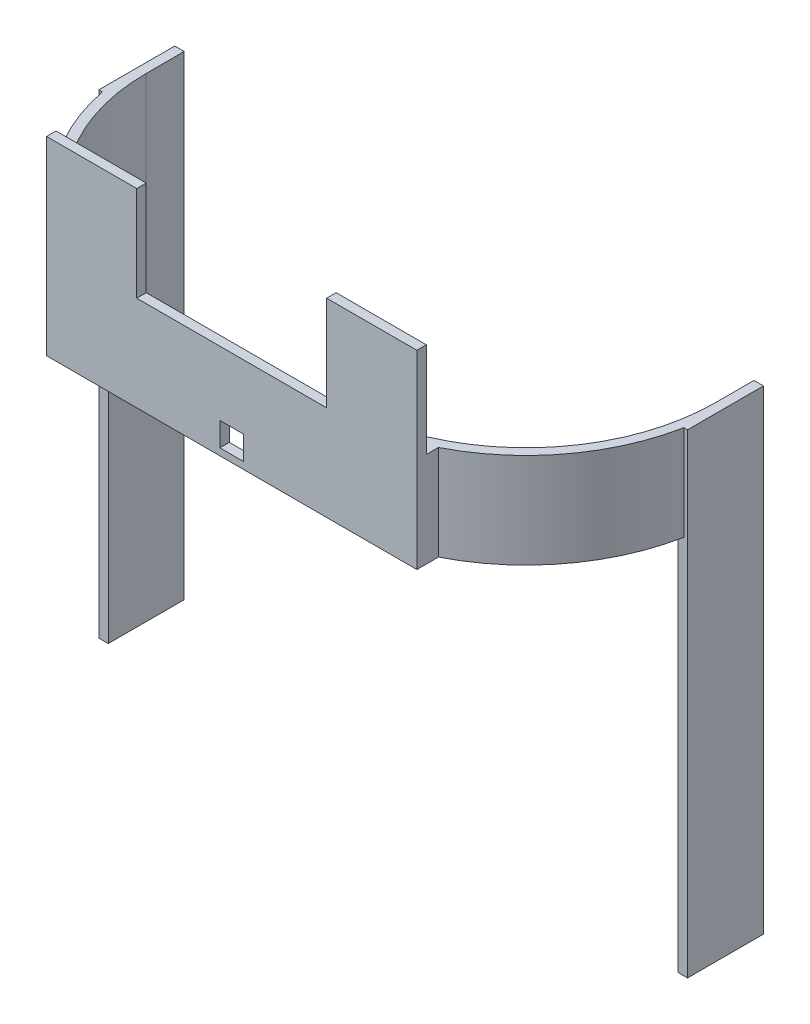
ISO-10303-21;
HEADER;
FILE_DESCRIPTION(('STEP AP214'),'2;1');
FILE_NAME('part.step','',(''),(''),'','','');
FILE_SCHEMA(('AUTOMOTIVE_DESIGN { 1 0 10303 214 1 1 1 1 }'));
ENDSEC;
DATA;
#1=APPLICATION_CONTEXT('core data for automotive mechanical design processes');
#2=APPLICATION_PROTOCOL_DEFINITION('international standard','automotive_design',2000,#1);
#3=PRODUCT_CONTEXT('',#1,'mechanical');
#4=PRODUCT('Part','Part','',(#3));
#5=PRODUCT_RELATED_PRODUCT_CATEGORY('part','',(#4));
#6=PRODUCT_DEFINITION_FORMATION('','',#4);
#7=PRODUCT_DEFINITION_CONTEXT('part definition',#1,'design');
#8=PRODUCT_DEFINITION('design','',#6,#7);
#9=PRODUCT_DEFINITION_SHAPE('','',#8);
#10=(LENGTH_UNIT() NAMED_UNIT(*) SI_UNIT(.MILLI.,.METRE.));
#11=(NAMED_UNIT(*) PLANE_ANGLE_UNIT() SI_UNIT($,.RADIAN.));
#12=(NAMED_UNIT(*) SI_UNIT($,.STERADIAN.) SOLID_ANGLE_UNIT());
#13=UNCERTAINTY_MEASURE_WITH_UNIT(LENGTH_MEASURE(1.E-05),#10,'distance_accuracy_value','');
#14=(GEOMETRIC_REPRESENTATION_CONTEXT(3) GLOBAL_UNCERTAINTY_ASSIGNED_CONTEXT((#13)) GLOBAL_UNIT_ASSIGNED_CONTEXT((#10,
#11,#12)) REPRESENTATION_CONTEXT('',''));
#15=CARTESIAN_POINT('',(0.,0.,0.));
#16=DIRECTION('',(0.,0.,1.));
#17=DIRECTION('',(1.,0.,0.));
#18=AXIS2_PLACEMENT_3D('',#15,#16,#17);
#19=CARTESIAN_POINT('',(40.,40.,0.));
#20=DIRECTION('',(0.,1.,0.));
#21=DIRECTION('',(0.,0.,1.));
#22=AXIS2_PLACEMENT_3D('',#19,#20,#21);
#23=PLANE('',#22);
#24=CARTESIAN_POINT('',(40.,40.,0.));
#25=DIRECTION('',(0.,-1.,0.));
#26=DIRECTION('',(0.,0.,1.));
#27=AXIS2_PLACEMENT_3D('',#24,#25,#26);
#28=CIRCLE('',#27,80.);
#29=CARTESIAN_POINT('',(120.,40.,0.));
#30=VERTEX_POINT('',#29);
#31=CARTESIAN_POINT('',(40.,40.,80.));
#32=VERTEX_POINT('',#31);
#33=EDGE_CURVE('E263',#30,#32,#28,.T.);
#34=ORIENTED_EDGE('',*,*,#33,.T.);
#35=DIRECTION('',(-1.,0.,0.));
#36=VECTOR('',#35,1.);
#37=CARTESIAN_POINT('',(78.,40.,80.));
#38=LINE('',#37,#36);
#39=CARTESIAN_POINT('',(78.,40.,80.));
#40=VERTEX_POINT('',#39);
#41=EDGE_CURVE('E400',#40,#32,#38,.T.);
#42=ORIENTED_EDGE('',*,*,#41,.F.);
#43=DIRECTION('',(0.,0.,-1.));
#44=VECTOR('',#43,1.);
#45=CARTESIAN_POINT('',(78.,40.,84.));
#46=LINE('',#45,#44);
#47=CARTESIAN_POINT('',(78.,40.,74.9132832013121));
#48=VERTEX_POINT('',#47);
#49=EDGE_CURVE('E357',#40,#48,#46,.T.);
#50=ORIENTED_EDGE('',*,*,#49,.T.);
#51=CARTESIAN_POINT('',(40.,40.,0.));
#52=DIRECTION('',(0.,1.,0.));
#53=DIRECTION('',(0.,0.,1.));
#54=AXIS2_PLACEMENT_3D('',#51,#52,#53);
#55=CIRCLE('',#54,84.);
#56=CARTESIAN_POINT('',(122.462112512353,40.,16.));
#57=VERTEX_POINT('',#56);
#58=EDGE_CURVE('E285',#48,#57,#55,.T.);
#59=ORIENTED_EDGE('',*,*,#58,.T.);
#60=DIRECTION('',(1.,0.,0.));
#61=VECTOR('',#60,1.);
#62=CARTESIAN_POINT('',(122.462112512353,40.,16.));
#63=LINE('',#62,#61);
#64=CARTESIAN_POINT('',(124.,40.,16.));
#65=VERTEX_POINT('',#64);
#66=EDGE_CURVE('E283',#57,#65,#63,.T.);
#67=ORIENTED_EDGE('',*,*,#66,.T.);
#68=DIRECTION('',(0.,0.,-1.));
#69=VECTOR('',#68,1.);
#70=CARTESIAN_POINT('',(124.,40.,-16.));
#71=LINE('',#70,#69);
#72=CARTESIAN_POINT('',(124.,40.,-16.));
#73=VERTEX_POINT('',#72);
#74=EDGE_CURVE('E281',#65,#73,#71,.T.);
#75=ORIENTED_EDGE('',*,*,#74,.T.);
#76=DIRECTION('',(-1.,0.,0.));
#77=VECTOR('',#76,1.);
#78=CARTESIAN_POINT('',(120.,40.,-16.));
#79=LINE('',#78,#77);
#80=CARTESIAN_POINT('',(120.,40.,-16.));
#81=VERTEX_POINT('',#80);
#82=EDGE_CURVE('E279',#73,#81,#79,.T.);
#83=ORIENTED_EDGE('',*,*,#82,.T.);
#84=DIRECTION('',(0.,0.,1.));
#85=VECTOR('',#84,1.);
#86=CARTESIAN_POINT('',(120.,40.,-16.));
#87=LINE('',#86,#85);
#88=EDGE_CURVE('E260',#81,#30,#87,.T.);
#89=ORIENTED_EDGE('',*,*,#88,.T.);
#90=EDGE_LOOP('',(#34,#42,#50,#59,#67,#75,#83,#89));
#91=FACE_BOUND('',#90,.T.);
#92=ADVANCED_FACE('F34',(#91),#23,.T.);
#93=DIRECTION('',(1.,0.,0.));
#94=VECTOR('',#93,1.);
#95=CARTESIAN_POINT('',(-40.,40.,84.));
#96=LINE('',#95,#94);
#97=CARTESIAN_POINT('',(-40.,40.,84.));
#98=VERTEX_POINT('',#97);
#99=CARTESIAN_POINT('',(40.,40.,84.));
#100=VERTEX_POINT('',#99);
#101=EDGE_CURVE('E287',#98,#100,#96,.T.);
#102=ORIENTED_EDGE('',*,*,#101,.T.);
#103=DIRECTION('',(0.,0.,1.));
#104=VECTOR('',#103,1.);
#105=CARTESIAN_POINT('',(40.,40.,84.));
#106=LINE('',#105,#104);
#107=EDGE_CURVE('E396',#32,#100,#106,.T.);
#108=ORIENTED_EDGE('',*,*,#107,.F.);
#109=DIRECTION('',(-1.,0.,0.));
#110=VECTOR('',#109,1.);
#111=CARTESIAN_POINT('',(-40.,40.,80.));
#112=LINE('',#111,#110);
#113=CARTESIAN_POINT('',(-40.,40.,80.));
#114=VERTEX_POINT('',#113);
#115=EDGE_CURVE('E302',#32,#114,#112,.T.);
#116=ORIENTED_EDGE('',*,*,#115,.T.);
#117=DIRECTION('',(0.,0.,-1.));
#118=VECTOR('',#117,1.);
#119=CARTESIAN_POINT('',(-40.,40.,84.));
#120=LINE('',#119,#118);
#121=EDGE_CURVE('E376',#98,#114,#120,.T.);
#122=ORIENTED_EDGE('',*,*,#121,.F.);
#123=EDGE_LOOP('',(#102,#108,#116,#122));
#124=FACE_BOUND('',#123,.T.);
#125=ADVANCED_FACE('F489',(#124),#23,.T.);
#126=DIRECTION('',(-1.,0.,0.));
#127=VECTOR('',#126,1.);
#128=CARTESIAN_POINT('',(-78.,40.,80.));
#129=LINE('',#128,#127);
#130=CARTESIAN_POINT('',(-78.,40.,80.));
#131=VERTEX_POINT('',#130);
#132=EDGE_CURVE('E372',#114,#131,#129,.T.);
#133=ORIENTED_EDGE('',*,*,#132,.F.);
#134=CARTESIAN_POINT('',(-40.,40.,0.));
#135=DIRECTION('',(0.,-1.,0.));
#136=DIRECTION('',(0.,0.,1.));
#137=AXIS2_PLACEMENT_3D('',#134,#135,#136);
#138=CIRCLE('',#137,80.);
#139=CARTESIAN_POINT('',(-120.,40.,0.));
#140=VERTEX_POINT('',#139);
#141=EDGE_CURVE('E300',#114,#140,#138,.T.);
#142=ORIENTED_EDGE('',*,*,#141,.T.);
#143=DIRECTION('',(0.,0.,-1.));
#144=VECTOR('',#143,1.);
#145=CARTESIAN_POINT('',(-120.,40.,-16.));
#146=LINE('',#145,#144);
#147=CARTESIAN_POINT('',(-120.,40.,-16.));
#148=VERTEX_POINT('',#147);
#149=EDGE_CURVE('E298',#140,#148,#146,.T.);
#150=ORIENTED_EDGE('',*,*,#149,.T.);
#151=DIRECTION('',(-1.,0.,0.));
#152=VECTOR('',#151,1.);
#153=CARTESIAN_POINT('',(-124.,40.,-16.));
#154=LINE('',#153,#152);
#155=CARTESIAN_POINT('',(-124.,40.,-16.));
#156=VERTEX_POINT('',#155);
#157=EDGE_CURVE('E296',#148,#156,#154,.T.);
#158=ORIENTED_EDGE('',*,*,#157,.T.);
#159=DIRECTION('',(0.,0.,1.));
#160=VECTOR('',#159,1.);
#161=CARTESIAN_POINT('',(-124.,40.,-16.));
#162=LINE('',#161,#160);
#163=CARTESIAN_POINT('',(-124.,40.,16.));
#164=VERTEX_POINT('',#163);
#165=EDGE_CURVE('E294',#156,#164,#162,.T.);
#166=ORIENTED_EDGE('',*,*,#165,.T.);
#167=DIRECTION('',(1.,0.,0.));
#168=VECTOR('',#167,1.);
#169=CARTESIAN_POINT('',(-124.,40.,16.));
#170=LINE('',#169,#168);
#171=CARTESIAN_POINT('',(-122.462112512353,40.,16.));
#172=VERTEX_POINT('',#171);
#173=EDGE_CURVE('E292',#164,#172,#170,.T.);
#174=ORIENTED_EDGE('',*,*,#173,.T.);
#175=CARTESIAN_POINT('',(-40.,40.,0.));
#176=DIRECTION('',(0.,1.,0.));
#177=DIRECTION('',(0.,0.,1.));
#178=AXIS2_PLACEMENT_3D('',#175,#176,#177);
#179=CIRCLE('',#178,84.);
#180=CARTESIAN_POINT('',(-78.,40.,74.9132832013121));
#181=VERTEX_POINT('',#180);
#182=EDGE_CURVE('E289',#172,#181,#179,.T.);
#183=ORIENTED_EDGE('',*,*,#182,.T.);
#184=DIRECTION('',(0.,0.,1.));
#185=VECTOR('',#184,1.);
#186=CARTESIAN_POINT('',(-78.,40.,84.));
#187=LINE('',#186,#185);
#188=EDGE_CURVE('E354',#181,#131,#187,.T.);
#189=ORIENTED_EDGE('',*,*,#188,.T.);
#190=EDGE_LOOP('',(#133,#142,#150,#158,#166,#174,#183,#189));
#191=FACE_BOUND('',#190,.T.);
#192=ADVANCED_FACE('F470',(#191),#23,.T.);
#193=CARTESIAN_POINT('',(40.,0.,0.));
#194=DIRECTION('',(0.,1.,0.));
#195=DIRECTION('',(0.,0.,1.));
#196=AXIS2_PLACEMENT_3D('',#193,#194,#195);
#197=PLANE('',#196);
#198=DIRECTION('',(0.,0.,1.));
#199=VECTOR('',#198,1.);
#200=CARTESIAN_POINT('',(-78.,0.,84.));
#201=LINE('',#200,#199);
#202=CARTESIAN_POINT('',(-78.,0.,74.9132832013121));
#203=VERTEX_POINT('',#202);
#204=CARTESIAN_POINT('',(-78.,0.,84.));
#205=VERTEX_POINT('',#204);
#206=EDGE_CURVE('E350',#203,#205,#201,.T.);
#207=ORIENTED_EDGE('',*,*,#206,.F.);
#208=CARTESIAN_POINT('',(-40.,0.,0.));
#209=DIRECTION('',(0.,1.,0.));
#210=DIRECTION('',(0.,0.,1.));
#211=AXIS2_PLACEMENT_3D('',#208,#209,#210);
#212=CIRCLE('',#211,84.);
#213=CARTESIAN_POINT('',(-122.462112512353,0.,16.));
#214=VERTEX_POINT('',#213);
#215=EDGE_CURVE('E266',#214,#203,#212,.T.);
#216=ORIENTED_EDGE('',*,*,#215,.F.);
#217=DIRECTION('',(-1.,0.,0.));
#218=VECTOR('',#217,1.);
#219=CARTESIAN_POINT('',(-124.,0.,16.));
#220=LINE('',#219,#218);
#221=CARTESIAN_POINT('',(-120.,0.,16.));
#222=VERTEX_POINT('',#221);
#223=EDGE_CURVE('E310',#222,#214,#220,.T.);
#224=ORIENTED_EDGE('',*,*,#223,.F.);
#225=DIRECTION('',(0.,0.,1.));
#226=VECTOR('',#225,1.);
#227=CARTESIAN_POINT('',(-120.,0.,-16.));
#228=LINE('',#227,#226);
#229=CARTESIAN_POINT('',(-120.,0.,0.));
#230=VERTEX_POINT('',#229);
#231=EDGE_CURVE('E215',#230,#222,#228,.T.);
#232=ORIENTED_EDGE('',*,*,#231,.F.);
#233=CARTESIAN_POINT('',(-40.,0.,0.));
#234=DIRECTION('',(0.,-1.,0.));
#235=DIRECTION('',(0.,0.,1.));
#236=AXIS2_PLACEMENT_3D('',#233,#234,#235);
#237=CIRCLE('',#236,80.);
#238=CARTESIAN_POINT('',(-40.,0.,80.));
#239=VERTEX_POINT('',#238);
#240=EDGE_CURVE('E269',#239,#230,#237,.T.);
#241=ORIENTED_EDGE('',*,*,#240,.F.);
#242=DIRECTION('',(-1.,0.,0.));
#243=VECTOR('',#242,1.);
#244=CARTESIAN_POINT('',(-40.,0.,80.));
#245=LINE('',#244,#243);
#246=CARTESIAN_POINT('',(40.,0.,80.));
#247=VERTEX_POINT('',#246);
#248=EDGE_CURVE('E272',#247,#239,#245,.T.);
#249=ORIENTED_EDGE('',*,*,#248,.F.);
#250=CARTESIAN_POINT('',(40.,0.,0.));
#251=DIRECTION('',(0.,-1.,0.));
#252=DIRECTION('',(0.,0.,1.));
#253=AXIS2_PLACEMENT_3D('',#250,#251,#252);
#254=CIRCLE('',#253,80.);
#255=CARTESIAN_POINT('',(120.,0.,0.));
#256=VERTEX_POINT('',#255);
#257=EDGE_CURVE('E274',#256,#247,#254,.T.);
#258=ORIENTED_EDGE('',*,*,#257,.F.);
#259=DIRECTION('',(0.,0.,-1.));
#260=VECTOR('',#259,1.);
#261=CARTESIAN_POINT('',(120.,0.,-16.));
#262=LINE('',#261,#260);
#263=CARTESIAN_POINT('',(120.,0.,16.));
#264=VERTEX_POINT('',#263);
#265=EDGE_CURVE('E332',#264,#256,#262,.T.);
#266=ORIENTED_EDGE('',*,*,#265,.F.);
#267=DIRECTION('',(-1.,0.,0.));
#268=VECTOR('',#267,1.);
#269=CARTESIAN_POINT('',(120.,0.,16.));
#270=LINE('',#269,#268);
#271=CARTESIAN_POINT('',(122.462112512353,0.,16.));
#272=VERTEX_POINT('',#271);
#273=EDGE_CURVE('E329',#272,#264,#270,.T.);
#274=ORIENTED_EDGE('',*,*,#273,.F.);
#275=CARTESIAN_POINT('',(40.,0.,0.));
#276=DIRECTION('',(0.,1.,0.));
#277=DIRECTION('',(0.,0.,1.));
#278=AXIS2_PLACEMENT_3D('',#275,#276,#277);
#279=CIRCLE('',#278,84.);
#280=CARTESIAN_POINT('',(78.,0.,74.9132832013121));
#281=VERTEX_POINT('',#280);
#282=EDGE_CURVE('E261',#281,#272,#279,.T.);
#283=ORIENTED_EDGE('',*,*,#282,.F.);
#284=DIRECTION('',(0.,0.,-1.));
#285=VECTOR('',#284,1.);
#286=CARTESIAN_POINT('',(78.,0.,84.));
#287=LINE('',#286,#285);
#288=CARTESIAN_POINT('',(78.,0.,84.));
#289=VERTEX_POINT('',#288);
#290=EDGE_CURVE('E356',#289,#281,#287,.T.);
#291=ORIENTED_EDGE('',*,*,#290,.F.);
#292=DIRECTION('',(1.,0.,0.));
#293=VECTOR('',#292,1.);
#294=CARTESIAN_POINT('',(-40.,0.,84.));
#295=LINE('',#294,#293);
#296=EDGE_CURVE('E264',#205,#289,#295,.T.);
#297=ORIENTED_EDGE('',*,*,#296,.F.);
#298=EDGE_LOOP('',(#207,#216,#224,#232,#241,#249,#258,#266,#274,#283,#291,#297));
#299=FACE_BOUND('',#298,.T.);
#300=ADVANCED_FACE('F443',(#299),#197,.F.);
#301=CARTESIAN_POINT('',(40.,40.,0.));
#302=DIRECTION('',(0.,-1.,0.));
#303=DIRECTION('',(0.,0.,-1.));
#304=AXIS2_PLACEMENT_3D('',#301,#302,#303);
#305=CYLINDRICAL_SURFACE('',#304,80.);
#306=ORIENTED_EDGE('',*,*,#257,.T.);
#307=DIRECTION('',(0.,-1.,0.));
#308=VECTOR('',#307,1.);
#309=CARTESIAN_POINT('',(40.,40.,80.));
#310=LINE('',#309,#308);
#311=EDGE_CURVE('E231',#32,#247,#310,.T.);
#312=ORIENTED_EDGE('',*,*,#311,.F.);
#313=ORIENTED_EDGE('',*,*,#33,.F.);
#314=DIRECTION('',(0.,-1.,0.));
#315=VECTOR('',#314,1.);
#316=CARTESIAN_POINT('',(120.,40.,0.));
#317=LINE('',#316,#315);
#318=EDGE_CURVE('E257',#30,#256,#317,.T.);
#319=ORIENTED_EDGE('',*,*,#318,.T.);
#320=EDGE_LOOP('',(#306,#312,#313,#319));
#321=FACE_BOUND('',#320,.T.);
#322=ADVANCED_FACE('F36',(#321),#305,.F.);
#323=CARTESIAN_POINT('',(-40.,40.,80.));
#324=DIRECTION('',(0.,0.,1.));
#325=DIRECTION('',(1.,0.,0.));
#326=AXIS2_PLACEMENT_3D('',#323,#324,#325);
#327=PLANE('',#326);
#328=DIRECTION('',(-1.,0.,0.));
#329=VECTOR('',#328,1.);
#330=CARTESIAN_POINT('',(-40.,12.9060091255901,80.));
#331=LINE('',#330,#329);
#332=CARTESIAN_POINT('',(5.00000000000001,12.9060091255901,80.));
#333=VERTEX_POINT('',#332);
#334=CARTESIAN_POINT('',(-4.99999999999998,12.9060091255901,80.));
#335=VERTEX_POINT('',#334);
#336=EDGE_CURVE('E414',#333,#335,#331,.T.);
#337=ORIENTED_EDGE('',*,*,#336,.T.);
#338=DIRECTION('',(0.,-1.,0.));
#339=VECTOR('',#338,1.);
#340=CARTESIAN_POINT('',(-4.99999999999998,40.,80.));
#341=LINE('',#340,#339);
#342=CARTESIAN_POINT('',(-4.99999999999998,2.90600912559006,80.));
#343=VERTEX_POINT('',#342);
#344=EDGE_CURVE('E403',#335,#343,#341,.T.);
#345=ORIENTED_EDGE('',*,*,#344,.T.);
#346=DIRECTION('',(1.,0.,0.));
#347=VECTOR('',#346,1.);
#348=CARTESIAN_POINT('',(-40.,2.90600912559006,80.));
#349=LINE('',#348,#347);
#350=CARTESIAN_POINT('',(5.00000000000001,2.90600912559006,80.));
#351=VERTEX_POINT('',#350);
#352=EDGE_CURVE('E418',#343,#351,#349,.T.);
#353=ORIENTED_EDGE('',*,*,#352,.T.);
#354=DIRECTION('',(0.,1.,0.));
#355=VECTOR('',#354,1.);
#356=CARTESIAN_POINT('',(5.,40.,80.));
#357=LINE('',#356,#355);
#358=EDGE_CURVE('E222',#351,#333,#357,.T.);
#359=ORIENTED_EDGE('',*,*,#358,.T.);
#360=EDGE_LOOP('',(#337,#345,#353,#359));
#361=FACE_BOUND('',#360,.T.);
#362=ORIENTED_EDGE('',*,*,#248,.T.);
#363=DIRECTION('',(0.,-1.,0.));
#364=VECTOR('',#363,1.);
#365=CARTESIAN_POINT('',(-40.,40.,80.));
#366=LINE('',#365,#364);
#367=EDGE_CURVE('E234',#114,#239,#366,.T.);
#368=ORIENTED_EDGE('',*,*,#367,.F.);
#369=ORIENTED_EDGE('',*,*,#115,.F.);
#370=ORIENTED_EDGE('',*,*,#311,.T.);
#371=EDGE_LOOP('',(#362,#368,#369,#370));
#372=FACE_BOUND('',#371,.T.);
#373=ADVANCED_FACE('F430',(#361,#372),#327,.F.);
#374=CARTESIAN_POINT('',(-40.,40.,0.));
#375=DIRECTION('',(0.,-1.,0.));
#376=DIRECTION('',(0.,0.,-1.));
#377=AXIS2_PLACEMENT_3D('',#374,#375,#376);
#378=CYLINDRICAL_SURFACE('',#377,80.);
#379=ORIENTED_EDGE('',*,*,#240,.T.);
#380=DIRECTION('',(0.,-1.,0.));
#381=VECTOR('',#380,1.);
#382=CARTESIAN_POINT('',(-120.,40.,0.));
#383=LINE('',#382,#381);
#384=EDGE_CURVE('E237',#140,#230,#383,.T.);
#385=ORIENTED_EDGE('',*,*,#384,.F.);
#386=ORIENTED_EDGE('',*,*,#141,.F.);
#387=ORIENTED_EDGE('',*,*,#367,.T.);
#388=EDGE_LOOP('',(#379,#385,#386,#387));
#389=FACE_BOUND('',#388,.T.);
#390=ADVANCED_FACE('F433',(#389),#378,.F.);
#391=CARTESIAN_POINT('',(-120.,40.,-16.));
#392=DIRECTION('',(-1.,0.,0.));
#393=DIRECTION('',(0.,0.,1.));
#394=AXIS2_PLACEMENT_3D('',#391,#392,#393);
#395=PLANE('',#394);
#396=ORIENTED_EDGE('',*,*,#384,.T.);
#397=ORIENTED_EDGE('',*,*,#231,.T.);
#398=DIRECTION('',(0.,1.,0.));
#399=VECTOR('',#398,1.);
#400=CARTESIAN_POINT('',(-120.,-160.,16.));
#401=LINE('',#400,#399);
#402=CARTESIAN_POINT('',(-120.,-160.,16.));
#403=VERTEX_POINT('',#402);
#404=EDGE_CURVE('E277',#403,#222,#401,.T.);
#405=ORIENTED_EDGE('',*,*,#404,.F.);
#406=DIRECTION('',(0.,0.,1.));
#407=VECTOR('',#406,1.);
#408=CARTESIAN_POINT('',(-120.,-160.,-16.));
#409=LINE('',#408,#407);
#410=CARTESIAN_POINT('',(-120.,-160.,-16.));
#411=VERTEX_POINT('',#410);
#412=EDGE_CURVE('E319',#411,#403,#409,.T.);
#413=ORIENTED_EDGE('',*,*,#412,.F.);
#414=DIRECTION('',(0.,-1.,0.));
#415=VECTOR('',#414,1.);
#416=CARTESIAN_POINT('',(-120.,40.,-16.));
#417=LINE('',#416,#415);
#418=EDGE_CURVE('E240',#148,#411,#417,.T.);
#419=ORIENTED_EDGE('',*,*,#418,.F.);
#420=ORIENTED_EDGE('',*,*,#149,.F.);
#421=EDGE_LOOP('',(#396,#397,#405,#413,#419,#420));
#422=FACE_BOUND('',#421,.T.);
#423=ADVANCED_FACE('F447',(#422),#395,.F.);
#424=CARTESIAN_POINT('',(-124.,40.,-16.));
#425=DIRECTION('',(0.,0.,1.));
#426=DIRECTION('',(1.,0.,0.));
#427=AXIS2_PLACEMENT_3D('',#424,#425,#426);
#428=PLANE('',#427);
#429=ORIENTED_EDGE('',*,*,#418,.T.);
#430=DIRECTION('',(1.,0.,0.));
#431=VECTOR('',#430,1.);
#432=CARTESIAN_POINT('',(-124.,-160.,-16.));
#433=LINE('',#432,#431);
#434=CARTESIAN_POINT('',(-124.,-160.,-16.));
#435=VERTEX_POINT('',#434);
#436=EDGE_CURVE('E321',#435,#411,#433,.T.);
#437=ORIENTED_EDGE('',*,*,#436,.F.);
#438=DIRECTION('',(0.,-1.,0.));
#439=VECTOR('',#438,1.);
#440=CARTESIAN_POINT('',(-124.,40.,-16.));
#441=LINE('',#440,#439);
#442=EDGE_CURVE('E242',#156,#435,#441,.T.);
#443=ORIENTED_EDGE('',*,*,#442,.F.);
#444=ORIENTED_EDGE('',*,*,#157,.F.);
#445=EDGE_LOOP('',(#429,#437,#443,#444));
#446=FACE_BOUND('',#445,.T.);
#447=ADVANCED_FACE('F466',(#446),#428,.F.);
#448=CARTESIAN_POINT('',(-124.,40.,-16.));
#449=DIRECTION('',(1.,0.,0.));
#450=DIRECTION('',(0.,0.,-1.));
#451=AXIS2_PLACEMENT_3D('',#448,#449,#450);
#452=PLANE('',#451);
#453=ORIENTED_EDGE('',*,*,#442,.T.);
#454=DIRECTION('',(0.,0.,-1.));
#455=VECTOR('',#454,1.);
#456=CARTESIAN_POINT('',(-124.,-160.,-16.));
#457=LINE('',#456,#455);
#458=CARTESIAN_POINT('',(-124.,-160.,16.));
#459=VERTEX_POINT('',#458);
#460=EDGE_CURVE('E313',#459,#435,#457,.T.);
#461=ORIENTED_EDGE('',*,*,#460,.F.);
#462=DIRECTION('',(0.,-1.,0.));
#463=VECTOR('',#462,1.);
#464=CARTESIAN_POINT('',(-124.,40.,16.));
#465=LINE('',#464,#463);
#466=EDGE_CURVE('E244',#164,#459,#465,.T.);
#467=ORIENTED_EDGE('',*,*,#466,.F.);
#468=ORIENTED_EDGE('',*,*,#165,.F.);
#469=EDGE_LOOP('',(#453,#461,#467,#468));
#470=FACE_BOUND('',#469,.T.);
#471=ADVANCED_FACE('F460',(#470),#452,.F.);
#472=CARTESIAN_POINT('',(-124.,40.,16.));
#473=DIRECTION('',(0.,0.,-1.));
#474=DIRECTION('',(-1.,0.,0.));
#475=AXIS2_PLACEMENT_3D('',#472,#473,#474);
#476=PLANE('',#475);
#477=ORIENTED_EDGE('',*,*,#466,.T.);
#478=DIRECTION('',(-1.,0.,0.));
#479=VECTOR('',#478,1.);
#480=CARTESIAN_POINT('',(-124.,-160.,16.));
#481=LINE('',#480,#479);
#482=EDGE_CURVE('E309',#403,#459,#481,.T.);
#483=ORIENTED_EDGE('',*,*,#482,.F.);
#484=ORIENTED_EDGE('',*,*,#404,.T.);
#485=ORIENTED_EDGE('',*,*,#223,.T.);
#486=DIRECTION('',(0.,-1.,0.));
#487=VECTOR('',#486,1.);
#488=CARTESIAN_POINT('',(-122.462112512353,40.,16.));
#489=LINE('',#488,#487);
#490=EDGE_CURVE('E246',#172,#214,#489,.T.);
#491=ORIENTED_EDGE('',*,*,#490,.F.);
#492=ORIENTED_EDGE('',*,*,#173,.F.);
#493=EDGE_LOOP('',(#477,#483,#484,#485,#491,#492));
#494=FACE_BOUND('',#493,.T.);
#495=ADVANCED_FACE('F452',(#494),#476,.F.);
#496=CARTESIAN_POINT('',(-40.,40.,0.));
#497=DIRECTION('',(0.,-1.,0.));
#498=DIRECTION('',(0.,0.,-1.));
#499=AXIS2_PLACEMENT_3D('',#496,#497,#498);
#500=CYLINDRICAL_SURFACE('',#499,84.);
#501=ORIENTED_EDGE('',*,*,#215,.T.);
#502=DIRECTION('',(0.,1.,0.));
#503=VECTOR('',#502,1.);
#504=CARTESIAN_POINT('',(-78.,0.,74.9132832013121));
#505=LINE('',#504,#503);
#506=EDGE_CURVE('E349',#203,#181,#505,.T.);
#507=ORIENTED_EDGE('',*,*,#506,.T.);
#508=ORIENTED_EDGE('',*,*,#182,.F.);
#509=ORIENTED_EDGE('',*,*,#490,.T.);
#510=EDGE_LOOP('',(#501,#507,#508,#509));
#511=FACE_BOUND('',#510,.T.);
#512=ADVANCED_FACE('F566',(#511),#500,.T.);
#513=CARTESIAN_POINT('',(-40.,40.,84.));
#514=DIRECTION('',(0.,0.,-1.));
#515=DIRECTION('',(-1.,0.,0.));
#516=AXIS2_PLACEMENT_3D('',#513,#514,#515);
#517=PLANE('',#516);
#518=DIRECTION('',(-1.,0.,0.));
#519=VECTOR('',#518,1.);
#520=CARTESIAN_POINT('',(-40.,2.90600912559006,84.));
#521=LINE('',#520,#519);
#522=CARTESIAN_POINT('',(5.00000000000002,2.90600912559006,84.));
#523=VERTEX_POINT('',#522);
#524=CARTESIAN_POINT('',(-4.99999999999998,2.90600912559006,84.));
#525=VERTEX_POINT('',#524);
#526=EDGE_CURVE('E210',#523,#525,#521,.T.);
#527=ORIENTED_EDGE('',*,*,#526,.T.);
#528=DIRECTION('',(0.,1.,0.));
#529=VECTOR('',#528,1.);
#530=CARTESIAN_POINT('',(-4.99999999999998,40.,84.));
#531=LINE('',#530,#529);
#532=CARTESIAN_POINT('',(-4.99999999999998,12.9060091255901,84.));
#533=VERTEX_POINT('',#532);
#534=EDGE_CURVE('E11',#525,#533,#531,.T.);
#535=ORIENTED_EDGE('',*,*,#534,.T.);
#536=DIRECTION('',(1.,0.,0.));
#537=VECTOR('',#536,1.);
#538=CARTESIAN_POINT('',(-40.,12.9060091255901,84.));
#539=LINE('',#538,#537);
#540=CARTESIAN_POINT('',(5.00000000000001,12.9060091255901,84.));
#541=VERTEX_POINT('',#540);
#542=EDGE_CURVE('E42',#533,#541,#539,.T.);
#543=ORIENTED_EDGE('',*,*,#542,.T.);
#544=DIRECTION('',(0.,-1.,0.));
#545=VECTOR('',#544,1.);
#546=CARTESIAN_POINT('',(5.,40.,84.));
#547=LINE('',#546,#545);
#548=EDGE_CURVE('E214',#541,#523,#547,.T.);
#549=ORIENTED_EDGE('',*,*,#548,.T.);
#550=EDGE_LOOP('',(#527,#535,#543,#549));
#551=FACE_BOUND('',#550,.T.);
#552=ORIENTED_EDGE('',*,*,#296,.T.);
#553=DIRECTION('',(0.,1.,0.));
#554=VECTOR('',#553,1.);
#555=CARTESIAN_POINT('',(78.,0.,84.));
#556=LINE('',#555,#554);
#557=CARTESIAN_POINT('',(78.,80.,84.));
#558=VERTEX_POINT('',#557);
#559=EDGE_CURVE('E347',#289,#558,#556,.T.);
#560=ORIENTED_EDGE('',*,*,#559,.T.);
#561=DIRECTION('',(1.,0.,0.));
#562=VECTOR('',#561,1.);
#563=CARTESIAN_POINT('',(78.,80.,84.));
#564=LINE('',#563,#562);
#565=CARTESIAN_POINT('',(40.,80.,84.));
#566=VERTEX_POINT('',#565);
#567=EDGE_CURVE('E395',#566,#558,#564,.T.);
#568=ORIENTED_EDGE('',*,*,#567,.F.);
#569=DIRECTION('',(0.,-1.,0.));
#570=VECTOR('',#569,1.);
#571=CARTESIAN_POINT('',(40.,80.,84.));
#572=LINE('',#571,#570);
#573=EDGE_CURVE('E392',#566,#100,#572,.T.);
#574=ORIENTED_EDGE('',*,*,#573,.T.);
#575=ORIENTED_EDGE('',*,*,#101,.F.);
#576=DIRECTION('',(0.,-1.,0.));
#577=VECTOR('',#576,1.);
#578=CARTESIAN_POINT('',(-40.,80.,84.));
#579=LINE('',#578,#577);
#580=CARTESIAN_POINT('',(-40.,80.,84.));
#581=VERTEX_POINT('',#580);
#582=EDGE_CURVE('E359',#581,#98,#579,.T.);
#583=ORIENTED_EDGE('',*,*,#582,.F.);
#584=DIRECTION('',(1.,0.,0.));
#585=VECTOR('',#584,1.);
#586=CARTESIAN_POINT('',(-78.,80.,84.));
#587=LINE('',#586,#585);
#588=CARTESIAN_POINT('',(-78.,80.,84.));
#589=VERTEX_POINT('',#588);
#590=EDGE_CURVE('E383',#589,#581,#587,.T.);
#591=ORIENTED_EDGE('',*,*,#590,.F.);
#592=DIRECTION('',(0.,1.,0.));
#593=VECTOR('',#592,1.);
#594=CARTESIAN_POINT('',(-78.,0.,84.));
#595=LINE('',#594,#593);
#596=EDGE_CURVE('E346',#205,#589,#595,.T.);
#597=ORIENTED_EDGE('',*,*,#596,.F.);
#598=EDGE_LOOP('',(#552,#560,#568,#574,#575,#583,#591,#597));
#599=FACE_BOUND('',#598,.T.);
#600=ADVANCED_FACE('F227',(#551,#599),#517,.F.);
#601=CARTESIAN_POINT('',(40.,40.,0.));
#602=DIRECTION('',(0.,-1.,0.));
#603=DIRECTION('',(0.,0.,-1.));
#604=AXIS2_PLACEMENT_3D('',#601,#602,#603);
#605=CYLINDRICAL_SURFACE('',#604,84.);
#606=ORIENTED_EDGE('',*,*,#58,.F.);
#607=DIRECTION('',(0.,-1.,0.));
#608=VECTOR('',#607,1.);
#609=CARTESIAN_POINT('',(78.,40.,74.9132832013121));
#610=LINE('',#609,#608);
#611=EDGE_CURVE('E334',#48,#281,#610,.T.);
#612=ORIENTED_EDGE('',*,*,#611,.T.);
#613=ORIENTED_EDGE('',*,*,#282,.T.);
#614=DIRECTION('',(0.,-1.,0.));
#615=VECTOR('',#614,1.);
#616=CARTESIAN_POINT('',(122.462112512353,40.,16.));
#617=LINE('',#616,#615);
#618=EDGE_CURVE('E248',#57,#272,#617,.T.);
#619=ORIENTED_EDGE('',*,*,#618,.F.);
#620=EDGE_LOOP('',(#606,#612,#613,#619));
#621=FACE_BOUND('',#620,.T.);
#622=ADVANCED_FACE('F519',(#621),#605,.T.);
#623=CARTESIAN_POINT('',(122.462112512353,40.,16.));
#624=DIRECTION('',(0.,0.,-1.));
#625=DIRECTION('',(-1.,0.,0.));
#626=AXIS2_PLACEMENT_3D('',#623,#624,#625);
#627=PLANE('',#626);
#628=ORIENTED_EDGE('',*,*,#618,.T.);
#629=ORIENTED_EDGE('',*,*,#273,.T.);
#630=DIRECTION('',(0.,1.,0.));
#631=VECTOR('',#630,1.);
#632=CARTESIAN_POINT('',(120.,-160.,16.));
#633=LINE('',#632,#631);
#634=CARTESIAN_POINT('',(120.,-160.,16.));
#635=VERTEX_POINT('',#634);
#636=EDGE_CURVE('E314',#635,#264,#633,.T.);
#637=ORIENTED_EDGE('',*,*,#636,.F.);
#638=DIRECTION('',(-1.,0.,0.));
#639=VECTOR('',#638,1.);
#640=CARTESIAN_POINT('',(120.,-160.,16.));
#641=LINE('',#640,#639);
#642=CARTESIAN_POINT('',(124.,-160.,16.));
#643=VERTEX_POINT('',#642);
#644=EDGE_CURVE('E328',#643,#635,#641,.T.);
#645=ORIENTED_EDGE('',*,*,#644,.F.);
#646=DIRECTION('',(0.,-1.,0.));
#647=VECTOR('',#646,1.);
#648=CARTESIAN_POINT('',(124.,40.,16.));
#649=LINE('',#648,#647);
#650=EDGE_CURVE('E251',#65,#643,#649,.T.);
#651=ORIENTED_EDGE('',*,*,#650,.F.);
#652=ORIENTED_EDGE('',*,*,#66,.F.);
#653=EDGE_LOOP('',(#628,#629,#637,#645,#651,#652));
#654=FACE_BOUND('',#653,.T.);
#655=ADVANCED_FACE('F513',(#654),#627,.F.);
#656=CARTESIAN_POINT('',(124.,40.,-16.));
#657=DIRECTION('',(-1.,0.,0.));
#658=DIRECTION('',(0.,0.,1.));
#659=AXIS2_PLACEMENT_3D('',#656,#657,#658);
#660=PLANE('',#659);
#661=ORIENTED_EDGE('',*,*,#650,.T.);
#662=DIRECTION('',(0.,0.,1.));
#663=VECTOR('',#662,1.);
#664=CARTESIAN_POINT('',(124.,-160.,-16.));
#665=LINE('',#664,#663);
#666=CARTESIAN_POINT('',(124.,-160.,-16.));
#667=VERTEX_POINT('',#666);
#668=EDGE_CURVE('E336',#667,#643,#665,.T.);
#669=ORIENTED_EDGE('',*,*,#668,.F.);
#670=DIRECTION('',(0.,-1.,0.));
#671=VECTOR('',#670,1.);
#672=CARTESIAN_POINT('',(124.,40.,-16.));
#673=LINE('',#672,#671);
#674=EDGE_CURVE('E253',#73,#667,#673,.T.);
#675=ORIENTED_EDGE('',*,*,#674,.F.);
#676=ORIENTED_EDGE('',*,*,#74,.F.);
#677=EDGE_LOOP('',(#661,#669,#675,#676));
#678=FACE_BOUND('',#677,.T.);
#679=ADVANCED_FACE('F555',(#678),#660,.F.);
#680=CARTESIAN_POINT('',(120.,40.,-16.));
#681=DIRECTION('',(0.,0.,1.));
#682=DIRECTION('',(1.,0.,0.));
#683=AXIS2_PLACEMENT_3D('',#680,#681,#682);
#684=PLANE('',#683);
#685=ORIENTED_EDGE('',*,*,#674,.T.);
#686=DIRECTION('',(1.,0.,0.));
#687=VECTOR('',#686,1.);
#688=CARTESIAN_POINT('',(120.,-160.,-16.));
#689=LINE('',#688,#687);
#690=CARTESIAN_POINT('',(120.,-160.,-16.));
#691=VERTEX_POINT('',#690);
#692=EDGE_CURVE('E339',#691,#667,#689,.T.);
#693=ORIENTED_EDGE('',*,*,#692,.F.);
#694=DIRECTION('',(0.,-1.,0.));
#695=VECTOR('',#694,1.);
#696=CARTESIAN_POINT('',(120.,40.,-16.));
#697=LINE('',#696,#695);
#698=EDGE_CURVE('E255',#81,#691,#697,.T.);
#699=ORIENTED_EDGE('',*,*,#698,.F.);
#700=ORIENTED_EDGE('',*,*,#82,.F.);
#701=EDGE_LOOP('',(#685,#693,#699,#700));
#702=FACE_BOUND('',#701,.T.);
#703=ADVANCED_FACE('F552',(#702),#684,.F.);
#704=CARTESIAN_POINT('',(120.,40.,-16.));
#705=DIRECTION('',(1.,0.,0.));
#706=DIRECTION('',(0.,0.,-1.));
#707=AXIS2_PLACEMENT_3D('',#704,#705,#706);
#708=PLANE('',#707);
#709=ORIENTED_EDGE('',*,*,#698,.T.);
#710=DIRECTION('',(0.,0.,-1.));
#711=VECTOR('',#710,1.);
#712=CARTESIAN_POINT('',(120.,-160.,-16.));
#713=LINE('',#712,#711);
#714=EDGE_CURVE('E331',#635,#691,#713,.T.);
#715=ORIENTED_EDGE('',*,*,#714,.F.);
#716=ORIENTED_EDGE('',*,*,#636,.T.);
#717=ORIENTED_EDGE('',*,*,#265,.T.);
#718=ORIENTED_EDGE('',*,*,#318,.F.);
#719=ORIENTED_EDGE('',*,*,#88,.F.);
#720=EDGE_LOOP('',(#709,#715,#716,#717,#718,#719));
#721=FACE_BOUND('',#720,.T.);
#722=ADVANCED_FACE('F508',(#721),#708,.F.);
#723=CARTESIAN_POINT('',(0.,-160.,0.));
#724=DIRECTION('',(0.,1.,0.));
#725=DIRECTION('',(0.,0.,1.));
#726=AXIS2_PLACEMENT_3D('',#723,#724,#725);
#727=PLANE('',#726);
#728=ORIENTED_EDGE('',*,*,#460,.T.);
#729=ORIENTED_EDGE('',*,*,#436,.T.);
#730=ORIENTED_EDGE('',*,*,#412,.T.);
#731=ORIENTED_EDGE('',*,*,#482,.T.);
#732=EDGE_LOOP('',(#728,#729,#730,#731));
#733=FACE_BOUND('',#732,.T.);
#734=ADVANCED_FACE('F458',(#733),#727,.F.);
#735=CARTESIAN_POINT('',(0.,-160.,0.));
#736=DIRECTION('',(0.,1.,0.));
#737=DIRECTION('',(0.,0.,1.));
#738=AXIS2_PLACEMENT_3D('',#735,#736,#737);
#739=PLANE('',#738);
#740=ORIENTED_EDGE('',*,*,#714,.T.);
#741=ORIENTED_EDGE('',*,*,#692,.T.);
#742=ORIENTED_EDGE('',*,*,#668,.T.);
#743=ORIENTED_EDGE('',*,*,#644,.T.);
#744=EDGE_LOOP('',(#740,#741,#742,#743));
#745=FACE_BOUND('',#744,.T.);
#746=ADVANCED_FACE('F634',(#745),#739,.F.);
#747=CARTESIAN_POINT('',(78.,0.,84.));
#748=DIRECTION('',(1.,0.,0.));
#749=DIRECTION('',(0.,0.,-1.));
#750=AXIS2_PLACEMENT_3D('',#747,#748,#749);
#751=PLANE('',#750);
#752=ORIENTED_EDGE('',*,*,#611,.F.);
#753=ORIENTED_EDGE('',*,*,#49,.F.);
#754=DIRECTION('',(0.,-1.,0.));
#755=VECTOR('',#754,1.);
#756=CARTESIAN_POINT('',(78.,80.,80.));
#757=LINE('',#756,#755);
#758=CARTESIAN_POINT('',(78.,80.,80.));
#759=VERTEX_POINT('',#758);
#760=EDGE_CURVE('E379',#759,#40,#757,.T.);
#761=ORIENTED_EDGE('',*,*,#760,.F.);
#762=DIRECTION('',(0.,0.,-1.));
#763=VECTOR('',#762,1.);
#764=CARTESIAN_POINT('',(78.,80.,84.));
#765=LINE('',#764,#763);
#766=EDGE_CURVE('E399',#558,#759,#765,.T.);
#767=ORIENTED_EDGE('',*,*,#766,.F.);
#768=ORIENTED_EDGE('',*,*,#559,.F.);
#769=ORIENTED_EDGE('',*,*,#290,.T.);
#770=EDGE_LOOP('',(#752,#753,#761,#767,#768,#769));
#771=FACE_BOUND('',#770,.T.);
#772=ADVANCED_FACE('F523',(#771),#751,.T.);
#773=CARTESIAN_POINT('',(-78.,0.,84.));
#774=DIRECTION('',(-1.,0.,0.));
#775=DIRECTION('',(0.,0.,1.));
#776=AXIS2_PLACEMENT_3D('',#773,#774,#775);
#777=PLANE('',#776);
#778=ORIENTED_EDGE('',*,*,#188,.F.);
#779=ORIENTED_EDGE('',*,*,#506,.F.);
#780=ORIENTED_EDGE('',*,*,#206,.T.);
#781=ORIENTED_EDGE('',*,*,#596,.T.);
#782=DIRECTION('',(0.,0.,1.));
#783=VECTOR('',#782,1.);
#784=CARTESIAN_POINT('',(-78.,80.,84.));
#785=LINE('',#784,#783);
#786=CARTESIAN_POINT('',(-78.,80.,80.));
#787=VERTEX_POINT('',#786);
#788=EDGE_CURVE('E375',#787,#589,#785,.T.);
#789=ORIENTED_EDGE('',*,*,#788,.F.);
#790=DIRECTION('',(0.,-1.,0.));
#791=VECTOR('',#790,1.);
#792=CARTESIAN_POINT('',(-78.,80.,80.));
#793=LINE('',#792,#791);
#794=EDGE_CURVE('E368',#787,#131,#793,.T.);
#795=ORIENTED_EDGE('',*,*,#794,.T.);
#796=EDGE_LOOP('',(#778,#779,#780,#781,#789,#795));
#797=FACE_BOUND('',#796,.T.);
#798=ADVANCED_FACE('F647',(#797),#777,.T.);
#799=CARTESIAN_POINT('',(-40.,80.,84.));
#800=DIRECTION('',(-1.,0.,0.));
#801=DIRECTION('',(0.,0.,1.));
#802=AXIS2_PLACEMENT_3D('',#799,#800,#801);
#803=PLANE('',#802);
#804=ORIENTED_EDGE('',*,*,#121,.T.);
#805=DIRECTION('',(0.,-1.,0.));
#806=VECTOR('',#805,1.);
#807=CARTESIAN_POINT('',(-40.,80.,80.));
#808=LINE('',#807,#806);
#809=CARTESIAN_POINT('',(-40.,80.,80.));
#810=VERTEX_POINT('',#809);
#811=EDGE_CURVE('E365',#810,#114,#808,.T.);
#812=ORIENTED_EDGE('',*,*,#811,.F.);
#813=DIRECTION('',(0.,0.,-1.));
#814=VECTOR('',#813,1.);
#815=CARTESIAN_POINT('',(-40.,80.,84.));
#816=LINE('',#815,#814);
#817=EDGE_CURVE('E381',#581,#810,#816,.T.);
#818=ORIENTED_EDGE('',*,*,#817,.F.);
#819=ORIENTED_EDGE('',*,*,#582,.T.);
#820=EDGE_LOOP('',(#804,#812,#818,#819));
#821=FACE_BOUND('',#820,.T.);
#822=ADVANCED_FACE('F475',(#821),#803,.F.);
#823=CARTESIAN_POINT('',(-78.,80.,80.));
#824=DIRECTION('',(0.,0.,1.));
#825=DIRECTION('',(1.,0.,0.));
#826=AXIS2_PLACEMENT_3D('',#823,#824,#825);
#827=PLANE('',#826);
#828=ORIENTED_EDGE('',*,*,#132,.T.);
#829=ORIENTED_EDGE('',*,*,#794,.F.);
#830=DIRECTION('',(-1.,0.,0.));
#831=VECTOR('',#830,1.);
#832=CARTESIAN_POINT('',(-78.,80.,80.));
#833=LINE('',#832,#831);
#834=EDGE_CURVE('E371',#810,#787,#833,.T.);
#835=ORIENTED_EDGE('',*,*,#834,.F.);
#836=ORIENTED_EDGE('',*,*,#811,.T.);
#837=EDGE_LOOP('',(#828,#829,#835,#836));
#838=FACE_BOUND('',#837,.T.);
#839=ADVANCED_FACE('F481',(#838),#827,.F.);
#840=CARTESIAN_POINT('',(0.,80.,0.));
#841=DIRECTION('',(0.,-1.,0.));
#842=DIRECTION('',(0.,0.,-1.));
#843=AXIS2_PLACEMENT_3D('',#840,#841,#842);
#844=PLANE('',#843);
#845=ORIENTED_EDGE('',*,*,#788,.T.);
#846=ORIENTED_EDGE('',*,*,#590,.T.);
#847=ORIENTED_EDGE('',*,*,#817,.T.);
#848=ORIENTED_EDGE('',*,*,#834,.T.);
#849=EDGE_LOOP('',(#845,#846,#847,#848));
#850=FACE_BOUND('',#849,.T.);
#851=ADVANCED_FACE('F484',(#850),#844,.F.);
#852=CARTESIAN_POINT('',(78.,80.,80.));
#853=DIRECTION('',(0.,0.,1.));
#854=DIRECTION('',(1.,0.,0.));
#855=AXIS2_PLACEMENT_3D('',#852,#853,#854);
#856=PLANE('',#855);
#857=ORIENTED_EDGE('',*,*,#41,.T.);
#858=DIRECTION('',(0.,-1.,0.));
#859=VECTOR('',#858,1.);
#860=CARTESIAN_POINT('',(40.,80.,80.));
#861=LINE('',#860,#859);
#862=CARTESIAN_POINT('',(40.,80.,80.));
#863=VERTEX_POINT('',#862);
#864=EDGE_CURVE('E389',#863,#32,#861,.T.);
#865=ORIENTED_EDGE('',*,*,#864,.F.);
#866=DIRECTION('',(-1.,0.,0.));
#867=VECTOR('',#866,1.);
#868=CARTESIAN_POINT('',(78.,80.,80.));
#869=LINE('',#868,#867);
#870=EDGE_CURVE('E408',#759,#863,#869,.T.);
#871=ORIENTED_EDGE('',*,*,#870,.F.);
#872=ORIENTED_EDGE('',*,*,#760,.T.);
#873=EDGE_LOOP('',(#857,#865,#871,#872));
#874=FACE_BOUND('',#873,.T.);
#875=ADVANCED_FACE('F495',(#874),#856,.F.);
#876=CARTESIAN_POINT('',(40.,80.,84.));
#877=DIRECTION('',(1.,0.,0.));
#878=DIRECTION('',(0.,0.,-1.));
#879=AXIS2_PLACEMENT_3D('',#876,#877,#878);
#880=PLANE('',#879);
#881=ORIENTED_EDGE('',*,*,#107,.T.);
#882=ORIENTED_EDGE('',*,*,#573,.F.);
#883=DIRECTION('',(0.,0.,1.));
#884=VECTOR('',#883,1.);
#885=CARTESIAN_POINT('',(40.,80.,84.));
#886=LINE('',#885,#884);
#887=EDGE_CURVE('E406',#863,#566,#886,.T.);
#888=ORIENTED_EDGE('',*,*,#887,.F.);
#889=ORIENTED_EDGE('',*,*,#864,.T.);
#890=EDGE_LOOP('',(#881,#882,#888,#889));
#891=FACE_BOUND('',#890,.T.);
#892=ADVANCED_FACE('F491',(#891),#880,.F.);
#893=CARTESIAN_POINT('',(0.,80.,0.));
#894=DIRECTION('',(0.,1.,0.));
#895=DIRECTION('',(0.,0.,1.));
#896=AXIS2_PLACEMENT_3D('',#893,#894,#895);
#897=PLANE('',#896);
#898=ORIENTED_EDGE('',*,*,#766,.T.);
#899=ORIENTED_EDGE('',*,*,#870,.T.);
#900=ORIENTED_EDGE('',*,*,#887,.T.);
#901=ORIENTED_EDGE('',*,*,#567,.T.);
#902=EDGE_LOOP('',(#898,#899,#900,#901));
#903=FACE_BOUND('',#902,.T.);
#904=ADVANCED_FACE('F526',(#903),#897,.T.);
#905=CARTESIAN_POINT('',(-4.99999999999998,12.9060091255901,-16.));
#906=DIRECTION('',(-1.,0.,0.));
#907=DIRECTION('',(0.,-1.,0.));
#908=AXIS2_PLACEMENT_3D('',#905,#906,#907);
#909=PLANE('',#908);
#910=DIRECTION('',(0.,0.,1.));
#911=VECTOR('',#910,1.);
#912=CARTESIAN_POINT('',(-4.99999999999998,12.9060091255901,-16.));
#913=LINE('',#912,#911);
#914=EDGE_CURVE('E420',#335,#533,#913,.T.);
#915=ORIENTED_EDGE('',*,*,#914,.T.);
#916=ORIENTED_EDGE('',*,*,#534,.F.);
#917=DIRECTION('',(0.,0.,1.));
#918=VECTOR('',#917,1.);
#919=CARTESIAN_POINT('',(-4.99999999999998,2.90600912559006,-16.));
#920=LINE('',#919,#918);
#921=EDGE_CURVE('E54',#343,#525,#920,.T.);
#922=ORIENTED_EDGE('',*,*,#921,.F.);
#923=ORIENTED_EDGE('',*,*,#344,.F.);
#924=EDGE_LOOP('',(#915,#916,#922,#923));
#925=FACE_BOUND('',#924,.T.);
#926=ADVANCED_FACE('F426',(#925),#909,.F.);
#927=CARTESIAN_POINT('',(-4.99999999999998,12.9060091255901,-16.));
#928=DIRECTION('',(0.,1.,0.));
#929=DIRECTION('',(-1.,0.,0.));
#930=AXIS2_PLACEMENT_3D('',#927,#928,#929);
#931=PLANE('',#930);
#932=DIRECTION('',(0.,0.,1.));
#933=VECTOR('',#932,1.);
#934=CARTESIAN_POINT('',(5.00000000000001,12.9060091255901,-16.));
#935=LINE('',#934,#933);
#936=EDGE_CURVE('E224',#333,#541,#935,.T.);
#937=ORIENTED_EDGE('',*,*,#936,.T.);
#938=ORIENTED_EDGE('',*,*,#542,.F.);
#939=ORIENTED_EDGE('',*,*,#914,.F.);
#940=ORIENTED_EDGE('',*,*,#336,.F.);
#941=EDGE_LOOP('',(#937,#938,#939,#940));
#942=FACE_BOUND('',#941,.T.);
#943=ADVANCED_FACE('F428',(#942),#931,.F.);
#944=CARTESIAN_POINT('',(5.00000000000001,12.9060091255901,-16.));
#945=DIRECTION('',(1.,0.,0.));
#946=DIRECTION('',(0.,1.,0.));
#947=AXIS2_PLACEMENT_3D('',#944,#945,#946);
#948=PLANE('',#947);
#949=DIRECTION('',(0.,0.,1.));
#950=VECTOR('',#949,1.);
#951=CARTESIAN_POINT('',(5.00000000000002,2.90600912559006,-16.));
#952=LINE('',#951,#950);
#953=EDGE_CURVE('E49',#351,#523,#952,.T.);
#954=ORIENTED_EDGE('',*,*,#953,.T.);
#955=ORIENTED_EDGE('',*,*,#548,.F.);
#956=ORIENTED_EDGE('',*,*,#936,.F.);
#957=ORIENTED_EDGE('',*,*,#358,.F.);
#958=EDGE_LOOP('',(#954,#955,#956,#957));
#959=FACE_BOUND('',#958,.T.);
#960=ADVANCED_FACE('F218',(#959),#948,.F.);
#961=CARTESIAN_POINT('',(-4.99999999999998,2.90600912559006,-16.));
#962=DIRECTION('',(0.,-1.,0.));
#963=DIRECTION('',(1.,0.,0.));
#964=AXIS2_PLACEMENT_3D('',#961,#962,#963);
#965=PLANE('',#964);
#966=ORIENTED_EDGE('',*,*,#921,.T.);
#967=ORIENTED_EDGE('',*,*,#526,.F.);
#968=ORIENTED_EDGE('',*,*,#953,.F.);
#969=ORIENTED_EDGE('',*,*,#352,.F.);
#970=EDGE_LOOP('',(#966,#967,#968,#969));
#971=FACE_BOUND('',#970,.T.);
#972=ADVANCED_FACE('F211',(#971),#965,.F.);
#973=CLOSED_SHELL('',(#92,#125,#192,#300,#322,#373,#390,#423,#447,#471,#495,#512,#600,#622,#655,
#679,#703,#722,#734,#746,#772,#798,#822,#839,#851,#875,#892,#904,#926,#943,#960,#972));
#974=MANIFOLD_SOLID_BREP('B2',#973);
#975=ADVANCED_BREP_SHAPE_REPRESENTATION('',(#18,#974),#14);
#976=SHAPE_DEFINITION_REPRESENTATION(#9,#975);
ENDSEC;
END-ISO-10303-21;
